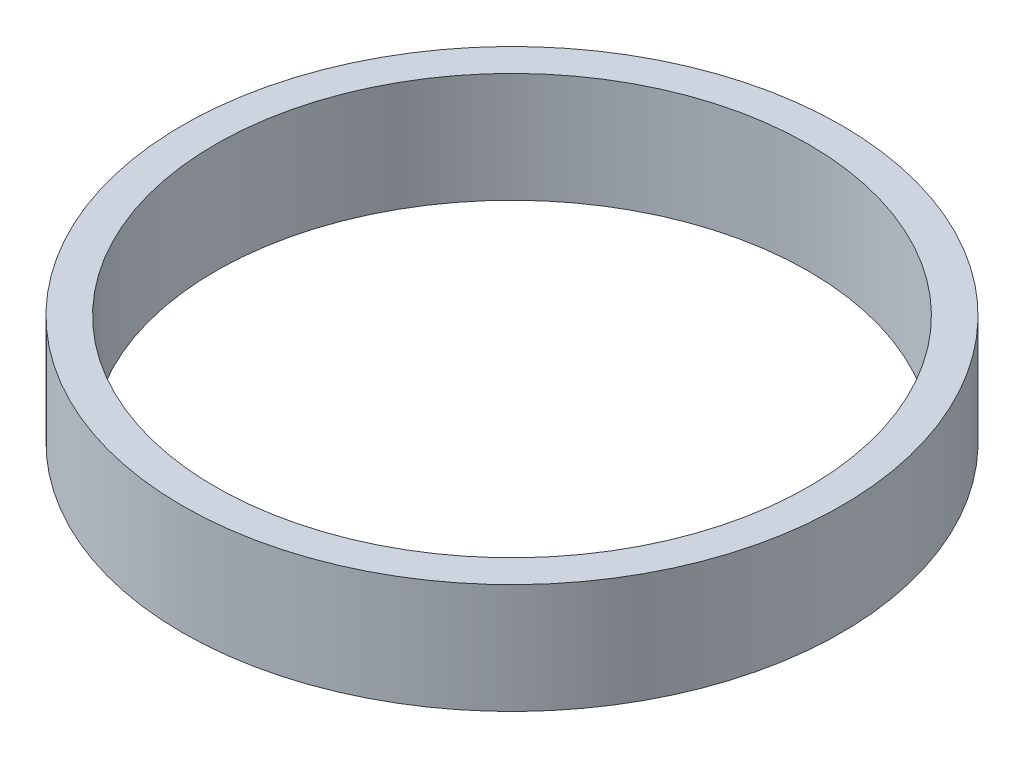
ISO-10303-21;
HEADER;
FILE_DESCRIPTION(('STEP AP214'),'2;1');
FILE_NAME('part.step','',(''),(''),'','','');
FILE_SCHEMA(('AUTOMOTIVE_DESIGN { 1 0 10303 214 1 1 1 1 }'));
ENDSEC;
DATA;
#1=APPLICATION_CONTEXT('core data for automotive mechanical design processes');
#2=APPLICATION_PROTOCOL_DEFINITION('international standard','automotive_design',2000,#1);
#3=PRODUCT_CONTEXT('',#1,'mechanical');
#4=PRODUCT('Part','Part','',(#3));
#5=PRODUCT_RELATED_PRODUCT_CATEGORY('part','',(#4));
#6=PRODUCT_DEFINITION_FORMATION('','',#4);
#7=PRODUCT_DEFINITION_CONTEXT('part definition',#1,'design');
#8=PRODUCT_DEFINITION('design','',#6,#7);
#9=PRODUCT_DEFINITION_SHAPE('','',#8);
#10=(LENGTH_UNIT() NAMED_UNIT(*) SI_UNIT(.MILLI.,.METRE.));
#11=(NAMED_UNIT(*) PLANE_ANGLE_UNIT() SI_UNIT($,.RADIAN.));
#12=(NAMED_UNIT(*) SI_UNIT($,.STERADIAN.) SOLID_ANGLE_UNIT());
#13=UNCERTAINTY_MEASURE_WITH_UNIT(LENGTH_MEASURE(1.E-05),#10,'distance_accuracy_value','');
#14=(GEOMETRIC_REPRESENTATION_CONTEXT(3) GLOBAL_UNCERTAINTY_ASSIGNED_CONTEXT((#13)) GLOBAL_UNIT_ASSIGNED_CONTEXT((#10,
#11,#12)) REPRESENTATION_CONTEXT('',''));
#15=CARTESIAN_POINT('',(0.,0.,0.));
#16=DIRECTION('',(0.,0.,1.));
#17=DIRECTION('',(1.,0.,0.));
#18=AXIS2_PLACEMENT_3D('',#15,#16,#17);
#19=CARTESIAN_POINT('',(0.,12.7,0.));
#20=DIRECTION('',(0.,-1.,0.));
#21=DIRECTION('',(0.,0.,-1.));
#22=AXIS2_PLACEMENT_3D('',#19,#20,#21);
#23=CYLINDRICAL_SURFACE('',#22,68.58);
#24=CARTESIAN_POINT('',(0.,-12.7,0.));
#25=DIRECTION('',(0.,-1.,0.));
#26=DIRECTION('',(0.,0.,-1.));
#27=AXIS2_PLACEMENT_3D('',#24,#25,#26);
#28=CIRCLE('',#27,68.58);
#29=CARTESIAN_POINT('',(0.,-12.7,-68.58));
#30=VERTEX_POINT('',#29);
#31=EDGE_CURVE('E27',#30,#30,#28,.T.);
#32=ORIENTED_EDGE('',*,*,#31,.T.);
#33=EDGE_LOOP('',(#32));
#34=FACE_BOUND('',#33,.T.);
#35=CARTESIAN_POINT('',(0.,12.7,0.));
#36=DIRECTION('',(0.,-1.,0.));
#37=DIRECTION('',(0.,0.,-1.));
#38=AXIS2_PLACEMENT_3D('',#35,#36,#37);
#39=CIRCLE('',#38,68.58);
#40=CARTESIAN_POINT('',(0.,12.7,-68.58));
#41=VERTEX_POINT('',#40);
#42=EDGE_CURVE('E18',#41,#41,#39,.T.);
#43=ORIENTED_EDGE('',*,*,#42,.F.);
#44=EDGE_LOOP('',(#43));
#45=FACE_BOUND('',#44,.T.);
#46=ADVANCED_FACE('F15',(#34,#45),#23,.F.);
#47=CARTESIAN_POINT('',(0.,12.7,0.));
#48=DIRECTION('',(0.,1.,0.));
#49=DIRECTION('',(0.,0.,1.));
#50=AXIS2_PLACEMENT_3D('',#47,#48,#49);
#51=PLANE('',#50);
#52=ORIENTED_EDGE('',*,*,#42,.T.);
#53=EDGE_LOOP('',(#52));
#54=FACE_BOUND('',#53,.T.);
#55=CARTESIAN_POINT('',(0.,12.7,0.));
#56=DIRECTION('',(0.,-1.,0.));
#57=DIRECTION('',(0.,0.,-1.));
#58=AXIS2_PLACEMENT_3D('',#55,#56,#57);
#59=CIRCLE('',#58,76.2);
#60=CARTESIAN_POINT('',(0.,12.7,-76.2));
#61=VERTEX_POINT('',#60);
#62=EDGE_CURVE('E22',#61,#61,#59,.T.);
#63=ORIENTED_EDGE('',*,*,#62,.F.);
#64=EDGE_LOOP('',(#63));
#65=FACE_BOUND('',#64,.T.);
#66=ADVANCED_FACE('F35',(#54,#65),#51,.T.);
#67=CARTESIAN_POINT('',(0.,-12.7,0.));
#68=DIRECTION('',(0.,1.,0.));
#69=DIRECTION('',(0.,0.,1.));
#70=AXIS2_PLACEMENT_3D('',#67,#68,#69);
#71=PLANE('',#70);
#72=ORIENTED_EDGE('',*,*,#31,.F.);
#73=EDGE_LOOP('',(#72));
#74=FACE_BOUND('',#73,.T.);
#75=CARTESIAN_POINT('',(0.,-12.7,0.));
#76=DIRECTION('',(0.,-1.,0.));
#77=DIRECTION('',(0.,0.,-1.));
#78=AXIS2_PLACEMENT_3D('',#75,#76,#77);
#79=CIRCLE('',#78,76.2);
#80=CARTESIAN_POINT('',(0.,-12.7,-76.2));
#81=VERTEX_POINT('',#80);
#82=EDGE_CURVE('E10',#81,#81,#79,.F.);
#83=ORIENTED_EDGE('',*,*,#82,.F.);
#84=EDGE_LOOP('',(#83));
#85=FACE_BOUND('',#84,.T.);
#86=ADVANCED_FACE('F43',(#74,#85),#71,.F.);
#87=CARTESIAN_POINT('',(0.,12.7,0.));
#88=DIRECTION('',(0.,-1.,0.));
#89=DIRECTION('',(0.,0.,-1.));
#90=AXIS2_PLACEMENT_3D('',#87,#88,#89);
#91=CYLINDRICAL_SURFACE('',#90,76.2);
#92=ORIENTED_EDGE('',*,*,#62,.T.);
#93=EDGE_LOOP('',(#92));
#94=FACE_BOUND('',#93,.T.);
#95=ORIENTED_EDGE('',*,*,#82,.T.);
#96=EDGE_LOOP('',(#95));
#97=FACE_BOUND('',#96,.T.);
#98=ADVANCED_FACE('F44',(#94,#97),#91,.T.);
#99=CLOSED_SHELL('',(#46,#66,#86,#98));
#100=MANIFOLD_SOLID_BREP('B1',#99);
#101=ADVANCED_BREP_SHAPE_REPRESENTATION('',(#18,#100),#14);
#102=SHAPE_DEFINITION_REPRESENTATION(#9,#101);
ENDSEC;
END-ISO-10303-21;
